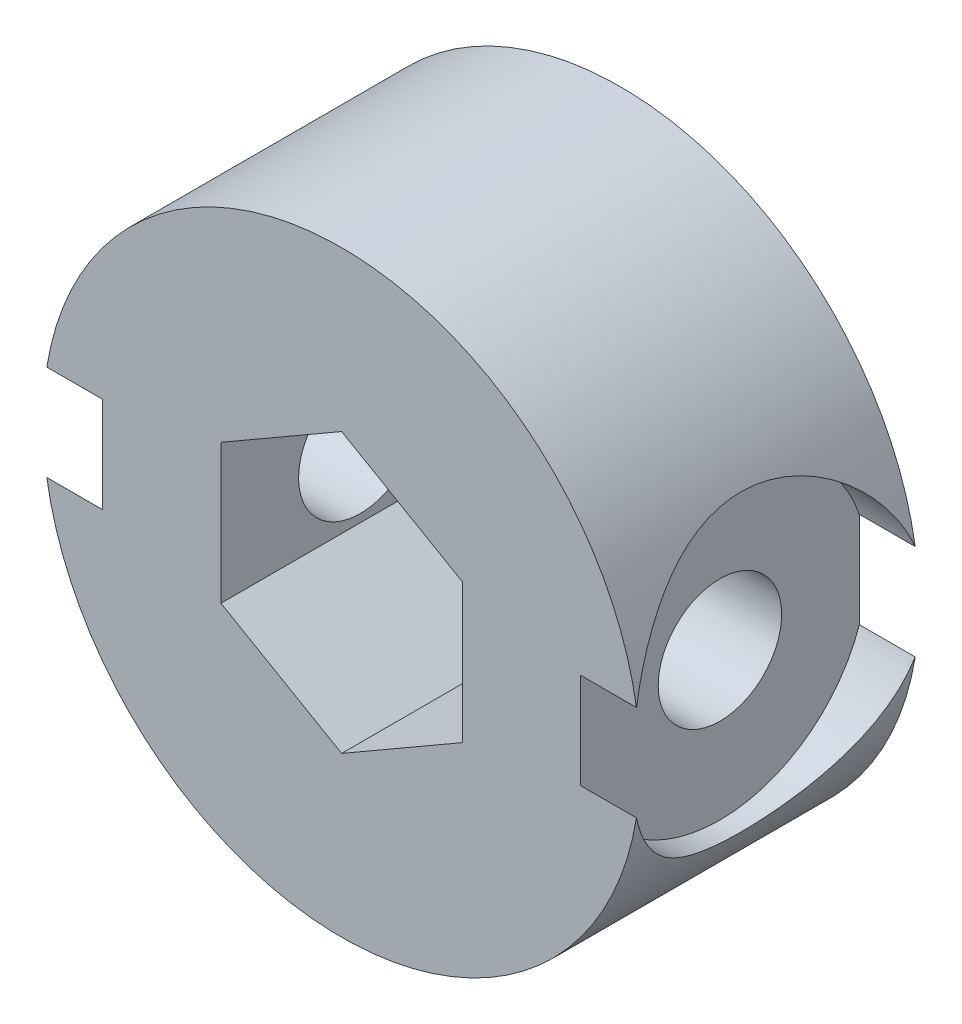
ISO-10303-21;
HEADER;
FILE_DESCRIPTION(('STEP AP214'),'2;1');
FILE_NAME('part.step','',(''),(''),'','','');
FILE_SCHEMA(('AUTOMOTIVE_DESIGN { 1 0 10303 214 1 1 1 1 }'));
ENDSEC;
DATA;
#1=APPLICATION_CONTEXT('core data for automotive mechanical design processes');
#2=APPLICATION_PROTOCOL_DEFINITION('international standard','automotive_design',2000,#1);
#3=PRODUCT_CONTEXT('',#1,'mechanical');
#4=PRODUCT('Part','Part','',(#3));
#5=PRODUCT_RELATED_PRODUCT_CATEGORY('part','',(#4));
#6=PRODUCT_DEFINITION_FORMATION('','',#4);
#7=PRODUCT_DEFINITION_CONTEXT('part definition',#1,'design');
#8=PRODUCT_DEFINITION('design','',#6,#7);
#9=PRODUCT_DEFINITION_SHAPE('','',#8);
#10=(LENGTH_UNIT() NAMED_UNIT(*) SI_UNIT(.MILLI.,.METRE.));
#11=(NAMED_UNIT(*) PLANE_ANGLE_UNIT() SI_UNIT($,.RADIAN.));
#12=(NAMED_UNIT(*) SI_UNIT($,.STERADIAN.) SOLID_ANGLE_UNIT());
#13=UNCERTAINTY_MEASURE_WITH_UNIT(LENGTH_MEASURE(1.E-05),#10,'distance_accuracy_value','');
#14=(GEOMETRIC_REPRESENTATION_CONTEXT(3) GLOBAL_UNCERTAINTY_ASSIGNED_CONTEXT((#13)) GLOBAL_UNIT_ASSIGNED_CONTEXT((#10,
#11,#12)) REPRESENTATION_CONTEXT('',''));
#15=CARTESIAN_POINT('',(0.,0.,0.));
#16=DIRECTION('',(0.,0.,1.));
#17=DIRECTION('',(1.,0.,0.));
#18=AXIS2_PLACEMENT_3D('',#15,#16,#17);
#19=CARTESIAN_POINT('',(0.,0.,7.));
#20=DIRECTION('',(0.,0.,-1.));
#21=DIRECTION('',(-1.,0.,0.));
#22=AXIS2_PLACEMENT_3D('',#19,#20,#21);
#23=CYLINDRICAL_SURFACE('',#22,7.5);
#24=CARTESIAN_POINT('',(0.,0.,7.));
#25=DIRECTION('',(0.,0.,1.));
#26=DIRECTION('',(1.,0.,0.));
#27=AXIS2_PLACEMENT_3D('',#24,#25,#26);
#28=CIRCLE('',#27,7.5);
#29=CARTESIAN_POINT('',(7.40337760755184,1.2,7.));
#30=VERTEX_POINT('',#29);
#31=CARTESIAN_POINT('',(-7.40337760755184,1.2,7.));
#32=VERTEX_POINT('',#31);
#33=EDGE_CURVE('E275',#30,#32,#28,.T.);
#34=ORIENTED_EDGE('',*,*,#33,.F.);
#35=CARTESIAN_POINT('',(7.40337760755184,1.2,7.));
#36=CARTESIAN_POINT('',(7.3872026742727,1.29987687851403,6.96576595060151));
#37=CARTESIAN_POINT('',(7.36921215868306,1.3979890467509,6.92734113423813));
#38=CARTESIAN_POINT('',(7.33016701983632,1.59002899796747,6.84257379805155));
#39=CARTESIAN_POINT('',(7.30911423974805,1.68395925392212,6.79623603810912));
#40=CARTESIAN_POINT('',(7.26455268122983,1.86684804450543,6.69620322582969));
#41=CARTESIAN_POINT('',(7.24105086427646,1.95581962459143,6.6425288993417));
#42=CARTESIAN_POINT('',(7.1921639071035,2.12857890719649,6.52818326676448));
#43=CARTESIAN_POINT('',(7.16677849264676,2.21236585160341,6.46751094110524));
#44=CARTESIAN_POINT('',(7.08885783591984,2.45495899258419,6.27588258805554));
#45=CARTESIAN_POINT('',(7.03442430865697,2.60552255871955,6.13502598601401));
#46=CARTESIAN_POINT('',(6.92599869631226,2.88142465434366,5.83019410771108));
#47=CARTESIAN_POINT('',(6.87200720701579,3.0067332494801,5.66619178391874));
#48=CARTESIAN_POINT('',(6.76810892470392,3.23404097064109,5.31034014206642));
#49=CARTESIAN_POINT('',(6.71848434706641,3.3347798098331,5.11758617318112));
#50=CARTESIAN_POINT('',(6.65444074083843,3.45985638346492,4.81578816984076));
#51=CARTESIAN_POINT('',(6.63482338812446,3.49721281954981,4.71306484690927));
#52=CARTESIAN_POINT('',(6.59981748773643,3.56283540184578,4.50407726444103));
#53=CARTESIAN_POINT('',(6.58442634948252,3.59110711861499,4.39781521906447));
#54=CARTESIAN_POINT('',(6.55958507356332,3.636269191305,4.19124371640927));
#55=CARTESIAN_POINT('',(6.54975809019732,3.65388925302293,4.0911383482199));
#56=CARTESIAN_POINT('',(6.53464854489542,3.68084339472088,3.88952315863813));
#57=CARTESIAN_POINT('',(6.52936365985955,3.69018171055765,3.78801408221294));
#58=CARTESIAN_POINT('',(6.52355685551279,3.70043842697249,3.58445603237282));
#59=CARTESIAN_POINT('',(6.52303364237077,3.70135911477042,3.48240721315683));
#60=CARTESIAN_POINT('',(6.52675829968913,3.69478381761248,3.27870008752506));
#61=CARTESIAN_POINT('',(6.53100588381585,3.68728833777805,3.17704175804031));
#62=CARTESIAN_POINT('',(6.54932108287321,3.65472986603883,2.89496536724448));
#63=CARTESIAN_POINT('',(6.56849832326923,3.62046146266257,2.71584382380234));
#64=CARTESIAN_POINT('',(6.61930160898538,3.52670111786295,2.36632743150038));
#65=CARTESIAN_POINT('',(6.65093077118144,3.46720286079543,2.19593477967201));
#66=CARTESIAN_POINT('',(6.72488720006169,3.32157513933543,1.85914264703174));
#67=CARTESIAN_POINT('',(6.7676614514551,3.23428710643732,1.69334446385542));
#68=CARTESIAN_POINT('',(6.85865223111727,3.03656414656375,1.37773397450485));
#69=CARTESIAN_POINT('',(6.90687333290336,2.9261096999378,1.22793531094195));
#70=CARTESIAN_POINT('',(7.01039303479795,2.66941967202546,0.929486072847494));
#71=CARTESIAN_POINT('',(7.06583527405608,2.52045889450587,0.783221949058878));
#72=CARTESIAN_POINT('',(7.17229089012618,2.19926182212156,0.517283631798725));
#73=CARTESIAN_POINT('',(7.22331027580715,2.02705794568235,0.397573006704796));
#74=CARTESIAN_POINT('',(7.29536856870484,1.74318414889116,0.234243841080121));
#75=CARTESIAN_POINT('',(7.31972796657183,1.63817868374236,0.180308147735383));
#76=CARTESIAN_POINT('',(7.36461529569372,1.42287716653979,0.0824864160826139));
#77=CARTESIAN_POINT('',(7.38514512693804,1.3125837723496,0.038595391778034));
#78=CARTESIAN_POINT('',(7.40337760755184,1.2,0.));
#79=B_SPLINE_CURVE_WITH_KNOTS('',3,(#35,#36,#37,#38,#39,#40,#41,#42,#43,#44,#45,#46,#47,#48,#49,
#50,#51,#52,#53,#54,#55,#56,#57,#58,#59,#60,#61,#62,#63,#64,#65,#66,#67,#68,#69,#70,#71,#72,#73,
#74,#75,#76,#77,#78),.UNSPECIFIED.,.F.,.F.,(4,2,2,2,2,2,2,2,2,2,2,2,2,2,2,2,2,2,2,2,2,4),(0.,
0.32027952409133,0.640367064430196,0.959568357283469,1.27881621489541,1.91549144147415,
2.55291692844372,3.21824185111407,3.55098250930725,3.88351874688542,4.18944549437662,
4.49521567941117,4.80090277875558,5.10657153235626,5.65398619884682,6.20153797747077,
6.77582756272413,7.35060299325953,7.99575641959668,8.64001913843472,9.00108452842977,
9.36197030130333),.UNSPECIFIED.);
#80=CARTESIAN_POINT('',(7.40337760755184,1.2,0.));
#81=VERTEX_POINT('',#80);
#82=EDGE_CURVE('E144',#30,#81,#79,.T.);
#83=ORIENTED_EDGE('',*,*,#82,.T.);
#84=CARTESIAN_POINT('',(0.,0.,0.));
#85=DIRECTION('',(0.,0.,1.));
#86=DIRECTION('',(1.,0.,0.));
#87=AXIS2_PLACEMENT_3D('',#84,#85,#86);
#88=CIRCLE('',#87,7.5);
#89=CARTESIAN_POINT('',(-7.40337760755184,1.2,0.));
#90=VERTEX_POINT('',#89);
#91=EDGE_CURVE('E271',#81,#90,#88,.T.);
#92=ORIENTED_EDGE('',*,*,#91,.T.);
#93=CARTESIAN_POINT('',(-7.40337760755184,1.2,7.));
#94=CARTESIAN_POINT('',(-7.3872026742727,1.29987687851403,6.96576595060151));
#95=CARTESIAN_POINT('',(-7.36921215868306,1.3979890467509,6.92734113423813));
#96=CARTESIAN_POINT('',(-7.33016701983632,1.59002899796747,6.84257379805155));
#97=CARTESIAN_POINT('',(-7.30911423974805,1.68395925392212,6.79623603810912));
#98=CARTESIAN_POINT('',(-7.26455268122983,1.86684804450543,6.69620322582969));
#99=CARTESIAN_POINT('',(-7.24105086427646,1.95581962459143,6.6425288993417));
#100=CARTESIAN_POINT('',(-7.1921639071035,2.12857890719649,6.52818326676449));
#101=CARTESIAN_POINT('',(-7.16677849264676,2.21236585160341,6.46751094110524));
#102=CARTESIAN_POINT('',(-7.08885783591984,2.45495899258419,6.27588258805554));
#103=CARTESIAN_POINT('',(-7.03442430865697,2.60552255871955,6.13502598601402));
#104=CARTESIAN_POINT('',(-6.92599869631226,2.88142465434366,5.83019410771108));
#105=CARTESIAN_POINT('',(-6.87200720701579,3.00673324948009,5.66619178391875));
#106=CARTESIAN_POINT('',(-6.76810892470393,3.23404097064109,5.31034014206642));
#107=CARTESIAN_POINT('',(-6.71848434706641,3.33477980983309,5.11758617318113));
#108=CARTESIAN_POINT('',(-6.65444074083844,3.45985638346492,4.81578816984077));
#109=CARTESIAN_POINT('',(-6.63482338812446,3.49721281954981,4.71306484690927));
#110=CARTESIAN_POINT('',(-6.59981748773643,3.56283540184578,4.50407726444103));
#111=CARTESIAN_POINT('',(-6.58442634948252,3.59110711861499,4.39781521906448));
#112=CARTESIAN_POINT('',(-6.55958507356332,3.636269191305,4.19124371640927));
#113=CARTESIAN_POINT('',(-6.54975809019732,3.65388925302293,4.0911383482199));
#114=CARTESIAN_POINT('',(-6.53464854489542,3.68084339472087,3.88952315863813));
#115=CARTESIAN_POINT('',(-6.52936365985955,3.69018171055765,3.78801408221295));
#116=CARTESIAN_POINT('',(-6.52355685551279,3.70043842697249,3.58445603237283));
#117=CARTESIAN_POINT('',(-6.52303364237077,3.70135911477042,3.48240721315683));
#118=CARTESIAN_POINT('',(-6.52675829968913,3.69478381761248,3.27870008752506));
#119=CARTESIAN_POINT('',(-6.53100588381585,3.68728833777805,3.17704175804031));
#120=CARTESIAN_POINT('',(-6.54932108287321,3.65472986603883,2.89496536724448));
#121=CARTESIAN_POINT('',(-6.56849832326923,3.62046146266257,2.71584382380235));
#122=CARTESIAN_POINT('',(-6.61930160898538,3.52670111786295,2.36632743150038));
#123=CARTESIAN_POINT('',(-6.65093077118144,3.46720286079543,2.19593477967201));
#124=CARTESIAN_POINT('',(-6.72488720006169,3.32157513933543,1.85914264703174));
#125=CARTESIAN_POINT('',(-6.7676614514551,3.23428710643732,1.69334446385542));
#126=CARTESIAN_POINT('',(-6.85865223111727,3.03656414656375,1.37773397450485));
#127=CARTESIAN_POINT('',(-6.90687333290336,2.9261096999378,1.22793531094195));
#128=CARTESIAN_POINT('',(-7.01039303479795,2.66941967202546,0.929486072847497));
#129=CARTESIAN_POINT('',(-7.06583527405607,2.52045889450587,0.78322194905888));
#130=CARTESIAN_POINT('',(-7.17229089012618,2.19926182212156,0.517283631798727));
#131=CARTESIAN_POINT('',(-7.22331027580715,2.02705794568235,0.397573006704798));
#132=CARTESIAN_POINT('',(-7.29536856870484,1.74318414889116,0.234243841080123));
#133=CARTESIAN_POINT('',(-7.31972796657183,1.63817868374236,0.180308147735385));
#134=CARTESIAN_POINT('',(-7.36461529569372,1.42287716653979,0.0824864160826148));
#135=CARTESIAN_POINT('',(-7.38514512693804,1.3125837723496,0.0385953917780344));
#136=CARTESIAN_POINT('',(-7.40337760755184,1.2,0.));
#137=B_SPLINE_CURVE_WITH_KNOTS('',3,(#93,#94,#95,#96,#97,#98,#99,#100,#101,#102,#103,#104,#105,
#106,#107,#108,#109,#110,#111,#112,#113,#114,#115,#116,#117,#118,#119,#120,#121,#122,#123,#124,
#125,#126,#127,#128,#129,#130,#131,#132,#133,#134,#135,#136),.UNSPECIFIED.,.F.,.F.,(4,2,2,2,2,2,
2,2,2,2,2,2,2,2,2,2,2,2,2,2,2,4),(0.,0.320279524091329,0.640367064430196,0.959568357283469,
1.27881621489541,1.91549144147415,2.55291692844372,3.21824185111407,3.55098250930725,
3.88351874688542,4.18944549437662,4.49521567941116,4.80090277875558,5.10657153235626,
5.65398619884682,6.20153797747077,6.77582756272412,7.35060299325953,7.99575641959668,
8.64001913843472,9.00108452842976,9.36197030130332),.UNSPECIFIED.);
#138=EDGE_CURVE('E195',#32,#90,#137,.T.);
#139=ORIENTED_EDGE('',*,*,#138,.F.);
#140=EDGE_LOOP('',(#34,#83,#92,#139));
#141=FACE_BOUND('',#140,.T.);
#142=ADVANCED_FACE('F37',(#141),#23,.T.);
#143=CARTESIAN_POINT('',(-7.40337760755184,-1.2,0.));
#144=VERTEX_POINT('',#143);
#145=CARTESIAN_POINT('',(7.40337760755184,-1.2,0.));
#146=VERTEX_POINT('',#145);
#147=EDGE_CURVE('E276',#144,#146,#88,.T.);
#148=ORIENTED_EDGE('',*,*,#147,.T.);
#149=CARTESIAN_POINT('',(7.40337760755184,-1.2,0.));
#150=CARTESIAN_POINT('',(7.3872026742727,-1.29987687851403,0.0342340493984903));
#151=CARTESIAN_POINT('',(7.36921215868306,-1.3979890467509,0.0726588657618682));
#152=CARTESIAN_POINT('',(7.33016701983632,-1.59002899796747,0.157426201948448));
#153=CARTESIAN_POINT('',(7.30911423974805,-1.68395925392212,0.203763961890879));
#154=CARTESIAN_POINT('',(7.26455268122983,-1.86684804450543,0.303796774170308));
#155=CARTESIAN_POINT('',(7.24105086427646,-1.95581962459143,0.357471100658296));
#156=CARTESIAN_POINT('',(7.1921639071035,-2.12857890719649,0.471816733235516));
#157=CARTESIAN_POINT('',(7.16677849264676,-2.21236585160341,0.53248905889476));
#158=CARTESIAN_POINT('',(7.08885783591984,-2.45495899258419,0.724117411944457));
#159=CARTESIAN_POINT('',(7.03442430865697,-2.60552255871955,0.864974013985987));
#160=CARTESIAN_POINT('',(6.92599869631226,-2.88142465434366,1.16980589228892));
#161=CARTESIAN_POINT('',(6.87200720701579,-3.0067332494801,1.33380821608126));
#162=CARTESIAN_POINT('',(6.76810892470393,-3.23404097064109,1.68965985793358));
#163=CARTESIAN_POINT('',(6.71848434706641,-3.33477980983309,1.88241382681888));
#164=CARTESIAN_POINT('',(6.65444074083844,-3.45985638346492,2.18421183015923));
#165=CARTESIAN_POINT('',(6.63482338812446,-3.49721281954981,2.28693515309073));
#166=CARTESIAN_POINT('',(6.59981748773643,-3.56283540184578,2.49592273555897));
#167=CARTESIAN_POINT('',(6.58442634948252,-3.59110711861499,2.60218478093553));
#168=CARTESIAN_POINT('',(6.55958507356332,-3.636269191305,2.80875628359073));
#169=CARTESIAN_POINT('',(6.54975809019732,-3.65388925302293,2.9088616517801));
#170=CARTESIAN_POINT('',(6.53464854489542,-3.68084339472087,3.11047684136187));
#171=CARTESIAN_POINT('',(6.52936365985955,-3.69018171055765,3.21198591778706));
#172=CARTESIAN_POINT('',(6.52355685551279,-3.70043842697249,3.41554396762718));
#173=CARTESIAN_POINT('',(6.52303364237077,-3.70135911477042,3.51759278684317));
#174=CARTESIAN_POINT('',(6.52675829968913,-3.69478381761248,3.72129991247494));
#175=CARTESIAN_POINT('',(6.53100588381585,-3.68728833777805,3.82295824195969));
#176=CARTESIAN_POINT('',(6.54932108287321,-3.65472986603883,4.10503463275552));
#177=CARTESIAN_POINT('',(6.56849832326923,-3.62046146266257,4.28415617619766));
#178=CARTESIAN_POINT('',(6.61930160898538,-3.52670111786295,4.63367256849962));
#179=CARTESIAN_POINT('',(6.65093077118144,-3.46720286079543,4.80406522032799));
#180=CARTESIAN_POINT('',(6.72488720006169,-3.32157513933543,5.14085735296826));
#181=CARTESIAN_POINT('',(6.76766145145511,-3.23428710643732,5.30665553614458));
#182=CARTESIAN_POINT('',(6.85865223111726,-3.03656414656374,5.62226602549515));
#183=CARTESIAN_POINT('',(6.90687333290336,-2.9261096999378,5.77206468905805));
#184=CARTESIAN_POINT('',(7.01039303479795,-2.66941967202546,6.07051392715251));
#185=CARTESIAN_POINT('',(7.06583527405608,-2.52045889450587,6.21677805094112));
#186=CARTESIAN_POINT('',(7.17229089012618,-2.19926182212156,6.48271636820128));
#187=CARTESIAN_POINT('',(7.22331027580715,-2.02705794568235,6.6024269932952));
#188=CARTESIAN_POINT('',(7.29536856870484,-1.74318414889116,6.76575615891988));
#189=CARTESIAN_POINT('',(7.31972796657183,-1.63817868374236,6.81969185226462));
#190=CARTESIAN_POINT('',(7.36461529569372,-1.42287716653979,6.91751358391739));
#191=CARTESIAN_POINT('',(7.38514512693804,-1.3125837723496,6.96140460822197));
#192=CARTESIAN_POINT('',(7.40337760755184,-1.2,7.));
#193=B_SPLINE_CURVE_WITH_KNOTS('',3,(#149,#150,#151,#152,#153,#154,#155,#156,#157,#158,#159,
#160,#161,#162,#163,#164,#165,#166,#167,#168,#169,#170,#171,#172,#173,#174,#175,#176,#177,#178,
#179,#180,#181,#182,#183,#184,#185,#186,#187,#188,#189,#190,#191,#192),.UNSPECIFIED.,.F.,.F.,(4,
2,2,2,2,2,2,2,2,2,2,2,2,2,2,2,2,2,2,2,2,4),(0.,0.32027952409133,0.640367064430196,
0.95956835728347,1.27881621489541,1.91549144147415,2.55291692844372,3.21824185111407,
3.55098250930725,3.88351874688542,4.18944549437662,4.49521567941117,4.80090277875558,
5.10657153235626,5.65398619884682,6.20153797747077,6.77582756272412,7.35060299325953,
7.99575641959668,8.64001913843472,9.00108452842976,9.36197030130332),.UNSPECIFIED.);
#194=CARTESIAN_POINT('',(7.40337760755184,-1.2,7.));
#195=VERTEX_POINT('',#194);
#196=EDGE_CURVE('E162',#146,#195,#193,.T.);
#197=ORIENTED_EDGE('',*,*,#196,.T.);
#198=CARTESIAN_POINT('',(-7.40337760755184,-1.2,7.));
#199=VERTEX_POINT('',#198);
#200=EDGE_CURVE('E272',#199,#195,#28,.T.);
#201=ORIENTED_EDGE('',*,*,#200,.F.);
#202=CARTESIAN_POINT('',(-7.40337760755184,-1.2,0.));
#203=CARTESIAN_POINT('',(-7.3872026742727,-1.29987687851403,0.0342340493984905));
#204=CARTESIAN_POINT('',(-7.36921215868306,-1.3979890467509,0.0726588657618684));
#205=CARTESIAN_POINT('',(-7.33016701983632,-1.59002899796747,0.157426201948448));
#206=CARTESIAN_POINT('',(-7.30911423974805,-1.68395925392212,0.203763961890879));
#207=CARTESIAN_POINT('',(-7.26455268122983,-1.86684804450543,0.303796774170307));
#208=CARTESIAN_POINT('',(-7.24105086427646,-1.95581962459143,0.357471100658295));
#209=CARTESIAN_POINT('',(-7.1921639071035,-2.12857890719649,0.471816733235515));
#210=CARTESIAN_POINT('',(-7.16677849264676,-2.21236585160341,0.53248905889476));
#211=CARTESIAN_POINT('',(-7.08885783591984,-2.45495899258419,0.724117411944456));
#212=CARTESIAN_POINT('',(-7.03442430865697,-2.60552255871955,0.864974013985986));
#213=CARTESIAN_POINT('',(-6.92599869631226,-2.88142465434366,1.16980589228892));
#214=CARTESIAN_POINT('',(-6.87200720701579,-3.0067332494801,1.33380821608126));
#215=CARTESIAN_POINT('',(-6.76810892470393,-3.23404097064109,1.68965985793358));
#216=CARTESIAN_POINT('',(-6.71848434706642,-3.33477980983309,1.88241382681888));
#217=CARTESIAN_POINT('',(-6.65444074083844,-3.45985638346492,2.18421183015923));
#218=CARTESIAN_POINT('',(-6.63482338812446,-3.49721281954981,2.28693515309073));
#219=CARTESIAN_POINT('',(-6.59981748773643,-3.56283540184578,2.49592273555897));
#220=CARTESIAN_POINT('',(-6.58442634948252,-3.59110711861499,2.60218478093553));
#221=CARTESIAN_POINT('',(-6.55958507356332,-3.636269191305,2.80875628359073));
#222=CARTESIAN_POINT('',(-6.54975809019732,-3.65388925302293,2.9088616517801));
#223=CARTESIAN_POINT('',(-6.53464854489542,-3.68084339472088,3.11047684136187));
#224=CARTESIAN_POINT('',(-6.52936365985955,-3.69018171055765,3.21198591778706));
#225=CARTESIAN_POINT('',(-6.52355685551279,-3.70043842697249,3.41554396762718));
#226=CARTESIAN_POINT('',(-6.52303364237077,-3.70135911477042,3.51759278684317));
#227=CARTESIAN_POINT('',(-6.52675829968913,-3.69478381761248,3.72129991247494));
#228=CARTESIAN_POINT('',(-6.53100588381585,-3.68728833777805,3.82295824195969));
#229=CARTESIAN_POINT('',(-6.54932108287321,-3.65472986603883,4.10503463275552));
#230=CARTESIAN_POINT('',(-6.56849832326923,-3.62046146266257,4.28415617619766));
#231=CARTESIAN_POINT('',(-6.61930160898538,-3.52670111786295,4.63367256849962));
#232=CARTESIAN_POINT('',(-6.65093077118144,-3.46720286079543,4.80406522032799));
#233=CARTESIAN_POINT('',(-6.72488720006169,-3.32157513933543,5.14085735296826));
#234=CARTESIAN_POINT('',(-6.7676614514551,-3.23428710643732,5.30665553614458));
#235=CARTESIAN_POINT('',(-6.85865223111726,-3.03656414656375,5.62226602549515));
#236=CARTESIAN_POINT('',(-6.90687333290336,-2.9261096999378,5.77206468905805));
#237=CARTESIAN_POINT('',(-7.01039303479795,-2.66941967202546,6.07051392715251));
#238=CARTESIAN_POINT('',(-7.06583527405607,-2.52045889450587,6.21677805094112));
#239=CARTESIAN_POINT('',(-7.17229089012618,-2.19926182212156,6.48271636820127));
#240=CARTESIAN_POINT('',(-7.22331027580715,-2.02705794568235,6.6024269932952));
#241=CARTESIAN_POINT('',(-7.29536856870484,-1.74318414889116,6.76575615891988));
#242=CARTESIAN_POINT('',(-7.31972796657183,-1.63817868374236,6.81969185226462));
#243=CARTESIAN_POINT('',(-7.36461529569372,-1.42287716653979,6.91751358391739));
#244=CARTESIAN_POINT('',(-7.38514512693804,-1.3125837723496,6.96140460822197));
#245=CARTESIAN_POINT('',(-7.40337760755184,-1.2,7.));
#246=B_SPLINE_CURVE_WITH_KNOTS('',3,(#202,#203,#204,#205,#206,#207,#208,#209,#210,#211,#212,
#213,#214,#215,#216,#217,#218,#219,#220,#221,#222,#223,#224,#225,#226,#227,#228,#229,#230,#231,
#232,#233,#234,#235,#236,#237,#238,#239,#240,#241,#242,#243,#244,#245),.UNSPECIFIED.,.F.,.F.,(4,
2,2,2,2,2,2,2,2,2,2,2,2,2,2,2,2,2,2,2,2,4),(0.,0.320279524091329,0.640367064430196,
0.959568357283469,1.27881621489541,1.91549144147415,2.55291692844372,3.21824185111407,
3.55098250930725,3.88351874688542,4.18944549437662,4.49521567941117,4.80090277875558,
5.10657153235626,5.65398619884682,6.20153797747077,6.77582756272413,7.35060299325953,
7.99575641959668,8.64001913843472,9.00108452842977,9.36197030130333),.UNSPECIFIED.);
#247=EDGE_CURVE('E213',#144,#199,#246,.T.);
#248=ORIENTED_EDGE('',*,*,#247,.F.);
#249=EDGE_LOOP('',(#148,#197,#201,#248));
#250=FACE_BOUND('',#249,.T.);
#251=ADVANCED_FACE('F39',(#250),#23,.T.);
#252=CARTESIAN_POINT('',(0.,0.,7.));
#253=DIRECTION('',(0.,0.,1.));
#254=DIRECTION('',(1.,0.,0.));
#255=AXIS2_PLACEMENT_3D('',#252,#253,#254);
#256=PLANE('',#255);
#257=DIRECTION('',(-1.,0.,0.));
#258=VECTOR('',#257,1.);
#259=CARTESIAN_POINT('',(10.,1.2,7.));
#260=LINE('',#259,#258);
#261=CARTESIAN_POINT('',(6.,1.2,7.));
#262=VERTEX_POINT('',#261);
#263=EDGE_CURVE('E139',#30,#262,#260,.T.);
#264=ORIENTED_EDGE('',*,*,#263,.F.);
#265=ORIENTED_EDGE('',*,*,#33,.T.);
#266=DIRECTION('',(1.,0.,0.));
#267=VECTOR('',#266,1.);
#268=CARTESIAN_POINT('',(-10.,1.2,7.));
#269=LINE('',#268,#267);
#270=CARTESIAN_POINT('',(-6.,1.2,7.));
#271=VERTEX_POINT('',#270);
#272=EDGE_CURVE('E202',#32,#271,#269,.T.);
#273=ORIENTED_EDGE('',*,*,#272,.T.);
#274=DIRECTION('',(0.,-1.,0.));
#275=VECTOR('',#274,1.);
#276=CARTESIAN_POINT('',(-6.,0.,7.));
#277=LINE('',#276,#275);
#278=CARTESIAN_POINT('',(-6.,-1.2,7.));
#279=VERTEX_POINT('',#278);
#280=EDGE_CURVE('E192',#271,#279,#277,.T.);
#281=ORIENTED_EDGE('',*,*,#280,.T.);
#282=DIRECTION('',(1.,0.,0.));
#283=VECTOR('',#282,1.);
#284=CARTESIAN_POINT('',(-10.,-1.2,7.));
#285=LINE('',#284,#283);
#286=EDGE_CURVE('E219',#279,#199,#285,.F.);
#287=ORIENTED_EDGE('',*,*,#286,.T.);
#288=ORIENTED_EDGE('',*,*,#200,.T.);
#289=DIRECTION('',(-1.,0.,0.));
#290=VECTOR('',#289,1.);
#291=CARTESIAN_POINT('',(10.,-1.2,7.));
#292=LINE('',#291,#290);
#293=CARTESIAN_POINT('',(6.,-1.2,7.));
#294=VERTEX_POINT('',#293);
#295=EDGE_CURVE('E161',#294,#195,#292,.F.);
#296=ORIENTED_EDGE('',*,*,#295,.F.);
#297=DIRECTION('',(0.,-1.,0.));
#298=VECTOR('',#297,1.);
#299=CARTESIAN_POINT('',(6.,0.,7.));
#300=LINE('',#299,#298);
#301=EDGE_CURVE('E152',#262,#294,#300,.T.);
#302=ORIENTED_EDGE('',*,*,#301,.F.);
#303=EDGE_LOOP('',(#264,#265,#273,#281,#287,#288,#296,#302));
#304=FACE_BOUND('',#303,.T.);
#305=DIRECTION('',(0.866025403784439,-0.499999999999999,0.));
#306=VECTOR('',#305,1.);
#307=CARTESIAN_POINT('',(0.,-3.5,7.));
#308=LINE('',#307,#306);
#309=CARTESIAN_POINT('',(-3.03108891324553,-1.75000000000001,7.));
#310=VERTEX_POINT('',#309);
#311=CARTESIAN_POINT('',(0.,-3.5,7.));
#312=VERTEX_POINT('',#311);
#313=EDGE_CURVE('E229',#310,#312,#308,.T.);
#314=ORIENTED_EDGE('',*,*,#313,.F.);
#315=DIRECTION('',(0.,-1.,0.));
#316=VECTOR('',#315,1.);
#317=CARTESIAN_POINT('',(-3.03108891324553,-1.75000000000001,7.));
#318=LINE('',#317,#316);
#319=CARTESIAN_POINT('',(-3.03108891324552,1.75000000000003,7.));
#320=VERTEX_POINT('',#319);
#321=EDGE_CURVE('E227',#320,#310,#318,.T.);
#322=ORIENTED_EDGE('',*,*,#321,.F.);
#323=DIRECTION('',(-0.866025403784441,-0.499999999999996,0.));
#324=VECTOR('',#323,1.);
#325=CARTESIAN_POINT('',(-3.03108891324552,1.75000000000003,7.));
#326=LINE('',#325,#324);
#327=CARTESIAN_POINT('',(0.,3.5,7.));
#328=VERTEX_POINT('',#327);
#329=EDGE_CURVE('E239',#328,#320,#326,.T.);
#330=ORIENTED_EDGE('',*,*,#329,.F.);
#331=DIRECTION('',(-0.866025403784439,0.499999999999999,0.));
#332=VECTOR('',#331,1.);
#333=CARTESIAN_POINT('',(0.,3.5,7.));
#334=LINE('',#333,#332);
#335=CARTESIAN_POINT('',(3.03108891324553,1.75000000000001,7.));
#336=VERTEX_POINT('',#335);
#337=EDGE_CURVE('E236',#336,#328,#334,.T.);
#338=ORIENTED_EDGE('',*,*,#337,.F.);
#339=DIRECTION('',(0.,1.,0.));
#340=VECTOR('',#339,1.);
#341=CARTESIAN_POINT('',(3.03108891324553,1.75000000000001,7.));
#342=LINE('',#341,#340);
#343=CARTESIAN_POINT('',(3.03108891324552,-1.75000000000002,7.));
#344=VERTEX_POINT('',#343);
#345=EDGE_CURVE('E234',#344,#336,#342,.T.);
#346=ORIENTED_EDGE('',*,*,#345,.F.);
#347=DIRECTION('',(0.866025403784441,0.499999999999997,0.));
#348=VECTOR('',#347,1.);
#349=CARTESIAN_POINT('',(3.03108891324552,-1.75000000000002,7.));
#350=LINE('',#349,#348);
#351=EDGE_CURVE('E232',#312,#344,#350,.T.);
#352=ORIENTED_EDGE('',*,*,#351,.F.);
#353=EDGE_LOOP('',(#314,#322,#330,#338,#346,#352));
#354=FACE_BOUND('',#353,.T.);
#355=ADVANCED_FACE('F158',(#304,#354),#256,.T.);
#356=CARTESIAN_POINT('',(0.,0.,0.));
#357=DIRECTION('',(0.,0.,1.));
#358=DIRECTION('',(1.,0.,0.));
#359=AXIS2_PLACEMENT_3D('',#356,#357,#358);
#360=PLANE('',#359);
#361=ORIENTED_EDGE('',*,*,#91,.F.);
#362=DIRECTION('',(-1.,0.,0.));
#363=VECTOR('',#362,1.);
#364=CARTESIAN_POINT('',(10.,1.2,0.));
#365=LINE('',#364,#363);
#366=CARTESIAN_POINT('',(6.,1.2,0.));
#367=VERTEX_POINT('',#366);
#368=EDGE_CURVE('E11',#81,#367,#365,.T.);
#369=ORIENTED_EDGE('',*,*,#368,.T.);
#370=DIRECTION('',(0.,-1.,0.));
#371=VECTOR('',#370,1.);
#372=CARTESIAN_POINT('',(6.,0.,0.));
#373=LINE('',#372,#371);
#374=CARTESIAN_POINT('',(6.,-1.2,0.));
#375=VERTEX_POINT('',#374);
#376=EDGE_CURVE('E154',#367,#375,#373,.T.);
#377=ORIENTED_EDGE('',*,*,#376,.T.);
#378=DIRECTION('',(-1.,0.,0.));
#379=VECTOR('',#378,1.);
#380=CARTESIAN_POINT('',(10.,-1.2,0.));
#381=LINE('',#380,#379);
#382=EDGE_CURVE('E46',#375,#146,#381,.F.);
#383=ORIENTED_EDGE('',*,*,#382,.T.);
#384=ORIENTED_EDGE('',*,*,#147,.F.);
#385=DIRECTION('',(1.,0.,0.));
#386=VECTOR('',#385,1.);
#387=CARTESIAN_POINT('',(-10.,-1.2,0.));
#388=LINE('',#387,#386);
#389=CARTESIAN_POINT('',(-6.,-1.2,0.));
#390=VERTEX_POINT('',#389);
#391=EDGE_CURVE('E284',#390,#144,#388,.F.);
#392=ORIENTED_EDGE('',*,*,#391,.F.);
#393=DIRECTION('',(0.,-1.,0.));
#394=VECTOR('',#393,1.);
#395=CARTESIAN_POINT('',(-6.,0.,0.));
#396=LINE('',#395,#394);
#397=CARTESIAN_POINT('',(-6.,1.2,0.));
#398=VERTEX_POINT('',#397);
#399=EDGE_CURVE('E190',#398,#390,#396,.T.);
#400=ORIENTED_EDGE('',*,*,#399,.F.);
#401=DIRECTION('',(1.,0.,0.));
#402=VECTOR('',#401,1.);
#403=CARTESIAN_POINT('',(-10.,1.2,0.));
#404=LINE('',#403,#402);
#405=EDGE_CURVE('E274',#90,#398,#404,.T.);
#406=ORIENTED_EDGE('',*,*,#405,.F.);
#407=EDGE_LOOP('',(#361,#369,#377,#383,#384,#392,#400,#406));
#408=FACE_BOUND('',#407,.T.);
#409=DIRECTION('',(0.,-1.,0.));
#410=VECTOR('',#409,1.);
#411=CARTESIAN_POINT('',(-3.03108891324553,-1.75000000000001,0.));
#412=LINE('',#411,#410);
#413=CARTESIAN_POINT('',(-3.03108891324552,1.75000000000003,0.));
#414=VERTEX_POINT('',#413);
#415=CARTESIAN_POINT('',(-3.03108891324553,-1.75000000000001,0.));
#416=VERTEX_POINT('',#415);
#417=EDGE_CURVE('E226',#414,#416,#412,.T.);
#418=ORIENTED_EDGE('',*,*,#417,.T.);
#419=DIRECTION('',(0.866025403784439,-0.499999999999999,0.));
#420=VECTOR('',#419,1.);
#421=CARTESIAN_POINT('',(0.,-3.5,0.));
#422=LINE('',#421,#420);
#423=CARTESIAN_POINT('',(0.,-3.5,0.));
#424=VERTEX_POINT('',#423);
#425=EDGE_CURVE('E244',#416,#424,#422,.T.);
#426=ORIENTED_EDGE('',*,*,#425,.T.);
#427=DIRECTION('',(0.866025403784441,0.499999999999997,0.));
#428=VECTOR('',#427,1.);
#429=CARTESIAN_POINT('',(3.03108891324552,-1.75000000000002,0.));
#430=LINE('',#429,#428);
#431=CARTESIAN_POINT('',(3.03108891324552,-1.75000000000002,0.));
#432=VERTEX_POINT('',#431);
#433=EDGE_CURVE('E247',#424,#432,#430,.T.);
#434=ORIENTED_EDGE('',*,*,#433,.T.);
#435=DIRECTION('',(0.,1.,0.));
#436=VECTOR('',#435,1.);
#437=CARTESIAN_POINT('',(3.03108891324553,1.75000000000001,0.));
#438=LINE('',#437,#436);
#439=CARTESIAN_POINT('',(3.03108891324553,1.75000000000001,0.));
#440=VERTEX_POINT('',#439);
#441=EDGE_CURVE('E250',#432,#440,#438,.T.);
#442=ORIENTED_EDGE('',*,*,#441,.T.);
#443=DIRECTION('',(-0.866025403784439,0.499999999999999,0.));
#444=VECTOR('',#443,1.);
#445=CARTESIAN_POINT('',(0.,3.5,0.));
#446=LINE('',#445,#444);
#447=CARTESIAN_POINT('',(0.,3.5,0.));
#448=VERTEX_POINT('',#447);
#449=EDGE_CURVE('E253',#440,#448,#446,.T.);
#450=ORIENTED_EDGE('',*,*,#449,.T.);
#451=DIRECTION('',(-0.866025403784441,-0.499999999999996,0.));
#452=VECTOR('',#451,1.);
#453=CARTESIAN_POINT('',(-3.03108891324552,1.75000000000003,0.));
#454=LINE('',#453,#452);
#455=EDGE_CURVE('E230',#448,#414,#454,.T.);
#456=ORIENTED_EDGE('',*,*,#455,.T.);
#457=EDGE_LOOP('',(#418,#426,#434,#442,#450,#456));
#458=FACE_BOUND('',#457,.T.);
#459=ADVANCED_FACE('F291',(#408,#458),#360,.F.);
#460=CARTESIAN_POINT('',(-7.5,0.,3.5));
#461=DIRECTION('',(1.,0.,0.));
#462=DIRECTION('',(0.,0.,-1.));
#463=AXIS2_PLACEMENT_3D('',#460,#461,#462);
#464=CYLINDRICAL_SURFACE('',#463,1.55);
#465=CARTESIAN_POINT('',(-3.03108891324553,0.,3.5));
#466=DIRECTION('',(1.,0.,0.));
#467=DIRECTION('',(0.,1.,0.));
#468=AXIS2_PLACEMENT_3D('',#465,#466,#467);
#469=CIRCLE('',#468,1.55);
#470=CARTESIAN_POINT('',(-3.03108891324552,1.55,3.5));
#471=VERTEX_POINT('',#470);
#472=EDGE_CURVE('E223',#471,#471,#469,.F.);
#473=ORIENTED_EDGE('',*,*,#472,.F.);
#474=EDGE_LOOP('',(#473));
#475=FACE_BOUND('',#474,.T.);
#476=CARTESIAN_POINT('',(-6.,0.,3.5));
#477=DIRECTION('',(-1.,0.,0.));
#478=DIRECTION('',(0.,0.,1.));
#479=AXIS2_PLACEMENT_3D('',#476,#477,#478);
#480=CIRCLE('',#479,1.55);
#481=CARTESIAN_POINT('',(-6.,0.,5.05));
#482=VERTEX_POINT('',#481);
#483=EDGE_CURVE('E189',#482,#482,#480,.T.);
#484=ORIENTED_EDGE('',*,*,#483,.T.);
#485=EDGE_LOOP('',(#484));
#486=FACE_BOUND('',#485,.T.);
#487=ADVANCED_FACE('F210',(#475,#486),#464,.F.);
#488=CARTESIAN_POINT('',(-3.03108891324553,-1.75000000000001,7.));
#489=DIRECTION('',(1.,0.,0.));
#490=DIRECTION('',(0.,1.,0.));
#491=AXIS2_PLACEMENT_3D('',#488,#489,#490);
#492=PLANE('',#491);
#493=ORIENTED_EDGE('',*,*,#472,.T.);
#494=EDGE_LOOP('',(#493));
#495=FACE_BOUND('',#494,.T.);
#496=ORIENTED_EDGE('',*,*,#417,.F.);
#497=DIRECTION('',(0.,0.,-1.));
#498=VECTOR('',#497,1.);
#499=CARTESIAN_POINT('',(-3.03108891324552,1.75000000000003,7.));
#500=LINE('',#499,#498);
#501=EDGE_CURVE('E241',#320,#414,#500,.T.);
#502=ORIENTED_EDGE('',*,*,#501,.F.);
#503=ORIENTED_EDGE('',*,*,#321,.T.);
#504=DIRECTION('',(0.,0.,-1.));
#505=VECTOR('',#504,1.);
#506=CARTESIAN_POINT('',(-3.03108891324553,-1.75000000000001,7.));
#507=LINE('',#506,#505);
#508=EDGE_CURVE('E268',#310,#416,#507,.T.);
#509=ORIENTED_EDGE('',*,*,#508,.T.);
#510=EDGE_LOOP('',(#496,#502,#503,#509));
#511=FACE_BOUND('',#510,.T.);
#512=ADVANCED_FACE('F318',(#495,#511),#492,.T.);
#513=CARTESIAN_POINT('',(0.,-3.5,7.));
#514=DIRECTION('',(0.499999999999999,0.866025403784439,0.));
#515=DIRECTION('',(-0.866025403784439,0.499999999999999,0.));
#516=AXIS2_PLACEMENT_3D('',#513,#514,#515);
#517=PLANE('',#516);
#518=ORIENTED_EDGE('',*,*,#425,.F.);
#519=ORIENTED_EDGE('',*,*,#508,.F.);
#520=ORIENTED_EDGE('',*,*,#313,.T.);
#521=DIRECTION('',(0.,0.,-1.));
#522=VECTOR('',#521,1.);
#523=CARTESIAN_POINT('',(0.,-3.5,7.));
#524=LINE('',#523,#522);
#525=EDGE_CURVE('E266',#312,#424,#524,.T.);
#526=ORIENTED_EDGE('',*,*,#525,.T.);
#527=EDGE_LOOP('',(#518,#519,#520,#526));
#528=FACE_BOUND('',#527,.T.);
#529=ADVANCED_FACE('F321',(#528),#517,.T.);
#530=CARTESIAN_POINT('',(3.03108891324552,-1.75000000000002,7.));
#531=DIRECTION('',(-0.499999999999997,0.86602540378444,0.));
#532=DIRECTION('',(-0.86602540378444,-0.499999999999997,0.));
#533=AXIS2_PLACEMENT_3D('',#530,#531,#532);
#534=PLANE('',#533);
#535=ORIENTED_EDGE('',*,*,#433,.F.);
#536=ORIENTED_EDGE('',*,*,#525,.F.);
#537=ORIENTED_EDGE('',*,*,#351,.T.);
#538=DIRECTION('',(0.,0.,-1.));
#539=VECTOR('',#538,1.);
#540=CARTESIAN_POINT('',(3.03108891324552,-1.75000000000002,7.));
#541=LINE('',#540,#539);
#542=EDGE_CURVE('E264',#344,#432,#541,.T.);
#543=ORIENTED_EDGE('',*,*,#542,.T.);
#544=EDGE_LOOP('',(#535,#536,#537,#543));
#545=FACE_BOUND('',#544,.T.);
#546=ADVANCED_FACE('F325',(#545),#534,.T.);
#547=CARTESIAN_POINT('',(3.03108891324553,1.75000000000001,7.));
#548=DIRECTION('',(-1.,0.,0.));
#549=DIRECTION('',(0.,-1.,0.));
#550=AXIS2_PLACEMENT_3D('',#547,#548,#549);
#551=PLANE('',#550);
#552=CARTESIAN_POINT('',(3.03108891324553,0.,3.5));
#553=DIRECTION('',(-1.,0.,0.));
#554=DIRECTION('',(0.,-1.,0.));
#555=AXIS2_PLACEMENT_3D('',#552,#553,#554);
#556=CIRCLE('',#555,1.55);
#557=CARTESIAN_POINT('',(3.03108891324552,-1.55,3.5));
#558=VERTEX_POINT('',#557);
#559=EDGE_CURVE('E222',#558,#558,#556,.F.);
#560=ORIENTED_EDGE('',*,*,#559,.T.);
#561=EDGE_LOOP('',(#560));
#562=FACE_BOUND('',#561,.T.);
#563=ORIENTED_EDGE('',*,*,#441,.F.);
#564=ORIENTED_EDGE('',*,*,#542,.F.);
#565=ORIENTED_EDGE('',*,*,#345,.T.);
#566=DIRECTION('',(0.,0.,-1.));
#567=VECTOR('',#566,1.);
#568=CARTESIAN_POINT('',(3.03108891324553,1.75000000000001,7.));
#569=LINE('',#568,#567);
#570=EDGE_CURVE('E262',#336,#440,#569,.T.);
#571=ORIENTED_EDGE('',*,*,#570,.T.);
#572=EDGE_LOOP('',(#563,#564,#565,#571));
#573=FACE_BOUND('',#572,.T.);
#574=ADVANCED_FACE('F329',(#562,#573),#551,.T.);
#575=CARTESIAN_POINT('',(0.,3.5,7.));
#576=DIRECTION('',(-0.499999999999999,-0.866025403784439,0.));
#577=DIRECTION('',(0.866025403784439,-0.499999999999999,0.));
#578=AXIS2_PLACEMENT_3D('',#575,#576,#577);
#579=PLANE('',#578);
#580=ORIENTED_EDGE('',*,*,#449,.F.);
#581=ORIENTED_EDGE('',*,*,#570,.F.);
#582=ORIENTED_EDGE('',*,*,#337,.T.);
#583=DIRECTION('',(0.,0.,-1.));
#584=VECTOR('',#583,1.);
#585=CARTESIAN_POINT('',(0.,3.5,7.));
#586=LINE('',#585,#584);
#587=EDGE_CURVE('E260',#328,#448,#586,.T.);
#588=ORIENTED_EDGE('',*,*,#587,.T.);
#589=EDGE_LOOP('',(#580,#581,#582,#588));
#590=FACE_BOUND('',#589,.T.);
#591=ADVANCED_FACE('F333',(#590),#579,.T.);
#592=CARTESIAN_POINT('',(-3.03108891324552,1.75000000000003,7.));
#593=DIRECTION('',(0.499999999999996,-0.866025403784441,0.));
#594=DIRECTION('',(0.866025403784441,0.499999999999996,0.));
#595=AXIS2_PLACEMENT_3D('',#592,#593,#594);
#596=PLANE('',#595);
#597=ORIENTED_EDGE('',*,*,#455,.F.);
#598=ORIENTED_EDGE('',*,*,#587,.F.);
#599=ORIENTED_EDGE('',*,*,#329,.T.);
#600=ORIENTED_EDGE('',*,*,#501,.T.);
#601=EDGE_LOOP('',(#597,#598,#599,#600));
#602=FACE_BOUND('',#601,.T.);
#603=ADVANCED_FACE('F336',(#602),#596,.T.);
#604=CARTESIAN_POINT('',(6.,0.,3.5));
#605=DIRECTION('',(-1.,0.,0.));
#606=DIRECTION('',(0.,0.,1.));
#607=AXIS2_PLACEMENT_3D('',#604,#605,#606);
#608=CIRCLE('',#607,1.55);
#609=CARTESIAN_POINT('',(6.,0.,5.05));
#610=VERTEX_POINT('',#609);
#611=EDGE_CURVE('E155',#610,#610,#608,.T.);
#612=ORIENTED_EDGE('',*,*,#611,.F.);
#613=EDGE_LOOP('',(#612));
#614=FACE_BOUND('',#613,.T.);
#615=ORIENTED_EDGE('',*,*,#559,.F.);
#616=EDGE_LOOP('',(#615));
#617=FACE_BOUND('',#616,.T.);
#618=ADVANCED_FACE('F339',(#614,#617),#464,.F.);
#619=CARTESIAN_POINT('',(-10.,0.,3.5));
#620=DIRECTION('',(1.,0.,0.));
#621=DIRECTION('',(0.,0.,-1.));
#622=AXIS2_PLACEMENT_3D('',#619,#620,#621);
#623=CYLINDRICAL_SURFACE('',#622,3.7);
#624=CARTESIAN_POINT('',(-6.,0.,3.5));
#625=DIRECTION('',(-1.,0.,0.));
#626=DIRECTION('',(0.,0.,1.));
#627=AXIS2_PLACEMENT_3D('',#624,#625,#626);
#628=CIRCLE('',#627,3.7);
#629=EDGE_CURVE('E148',#390,#279,#628,.T.);
#630=ORIENTED_EDGE('',*,*,#629,.F.);
#631=ORIENTED_EDGE('',*,*,#391,.T.);
#632=ORIENTED_EDGE('',*,*,#247,.T.);
#633=ORIENTED_EDGE('',*,*,#286,.F.);
#634=EDGE_LOOP('',(#630,#631,#632,#633));
#635=FACE_BOUND('',#634,.T.);
#636=ADVANCED_FACE('F209',(#635),#623,.F.);
#637=CARTESIAN_POINT('',(-6.,0.,3.5));
#638=DIRECTION('',(-1.,0.,0.));
#639=DIRECTION('',(0.,0.,1.));
#640=AXIS2_PLACEMENT_3D('',#637,#638,#639);
#641=PLANE('',#640);
#642=ORIENTED_EDGE('',*,*,#483,.F.);
#643=EDGE_LOOP('',(#642));
#644=FACE_BOUND('',#643,.T.);
#645=EDGE_CURVE('E61',#271,#398,#628,.T.);
#646=ORIENTED_EDGE('',*,*,#645,.T.);
#647=ORIENTED_EDGE('',*,*,#399,.T.);
#648=ORIENTED_EDGE('',*,*,#629,.T.);
#649=ORIENTED_EDGE('',*,*,#280,.F.);
#650=EDGE_LOOP('',(#646,#647,#648,#649));
#651=FACE_BOUND('',#650,.T.);
#652=ADVANCED_FACE('F180',(#644,#651),#641,.T.);
#653=ORIENTED_EDGE('',*,*,#138,.T.);
#654=ORIENTED_EDGE('',*,*,#405,.T.);
#655=ORIENTED_EDGE('',*,*,#645,.F.);
#656=ORIENTED_EDGE('',*,*,#272,.F.);
#657=EDGE_LOOP('',(#653,#654,#655,#656));
#658=FACE_BOUND('',#657,.T.);
#659=ADVANCED_FACE('F204',(#658),#623,.F.);
#660=CARTESIAN_POINT('',(10.,0.,3.5));
#661=DIRECTION('',(-1.,0.,0.));
#662=DIRECTION('',(0.,0.,1.));
#663=AXIS2_PLACEMENT_3D('',#660,#661,#662);
#664=CYLINDRICAL_SURFACE('',#663,3.7);
#665=ORIENTED_EDGE('',*,*,#263,.T.);
#666=CARTESIAN_POINT('',(6.,0.,3.5));
#667=DIRECTION('',(-1.,0.,0.));
#668=DIRECTION('',(0.,0.,1.));
#669=AXIS2_PLACEMENT_3D('',#666,#667,#668);
#670=CIRCLE('',#669,3.7);
#671=EDGE_CURVE('E142',#262,#367,#670,.T.);
#672=ORIENTED_EDGE('',*,*,#671,.T.);
#673=ORIENTED_EDGE('',*,*,#368,.F.);
#674=ORIENTED_EDGE('',*,*,#82,.F.);
#675=EDGE_LOOP('',(#665,#672,#673,#674));
#676=FACE_BOUND('',#675,.T.);
#677=ADVANCED_FACE('F141',(#676),#664,.F.);
#678=CARTESIAN_POINT('',(6.,0.,3.5));
#679=DIRECTION('',(-1.,0.,0.));
#680=DIRECTION('',(0.,0.,1.));
#681=AXIS2_PLACEMENT_3D('',#678,#679,#680);
#682=PLANE('',#681);
#683=ORIENTED_EDGE('',*,*,#301,.T.);
#684=EDGE_CURVE('E53',#375,#294,#670,.T.);
#685=ORIENTED_EDGE('',*,*,#684,.F.);
#686=ORIENTED_EDGE('',*,*,#376,.F.);
#687=ORIENTED_EDGE('',*,*,#671,.F.);
#688=EDGE_LOOP('',(#683,#685,#686,#687));
#689=FACE_BOUND('',#688,.T.);
#690=ORIENTED_EDGE('',*,*,#611,.T.);
#691=EDGE_LOOP('',(#690));
#692=FACE_BOUND('',#691,.T.);
#693=ADVANCED_FACE('F150',(#689,#692),#682,.F.);
#694=ORIENTED_EDGE('',*,*,#295,.T.);
#695=ORIENTED_EDGE('',*,*,#196,.F.);
#696=ORIENTED_EDGE('',*,*,#382,.F.);
#697=ORIENTED_EDGE('',*,*,#684,.T.);
#698=EDGE_LOOP('',(#694,#695,#696,#697));
#699=FACE_BOUND('',#698,.T.);
#700=ADVANCED_FACE('F174',(#699),#664,.F.);
#701=CLOSED_SHELL('',(#142,#251,#355,#459,#487,#512,#529,#546,#574,#591,#603,#618,#636,#652,
#659,#677,#693,#700));
#702=MANIFOLD_SOLID_BREP('B2',#701);
#703=ADVANCED_BREP_SHAPE_REPRESENTATION('',(#18,#702),#14);
#704=SHAPE_DEFINITION_REPRESENTATION(#9,#703);
ENDSEC;
END-ISO-10303-21;
